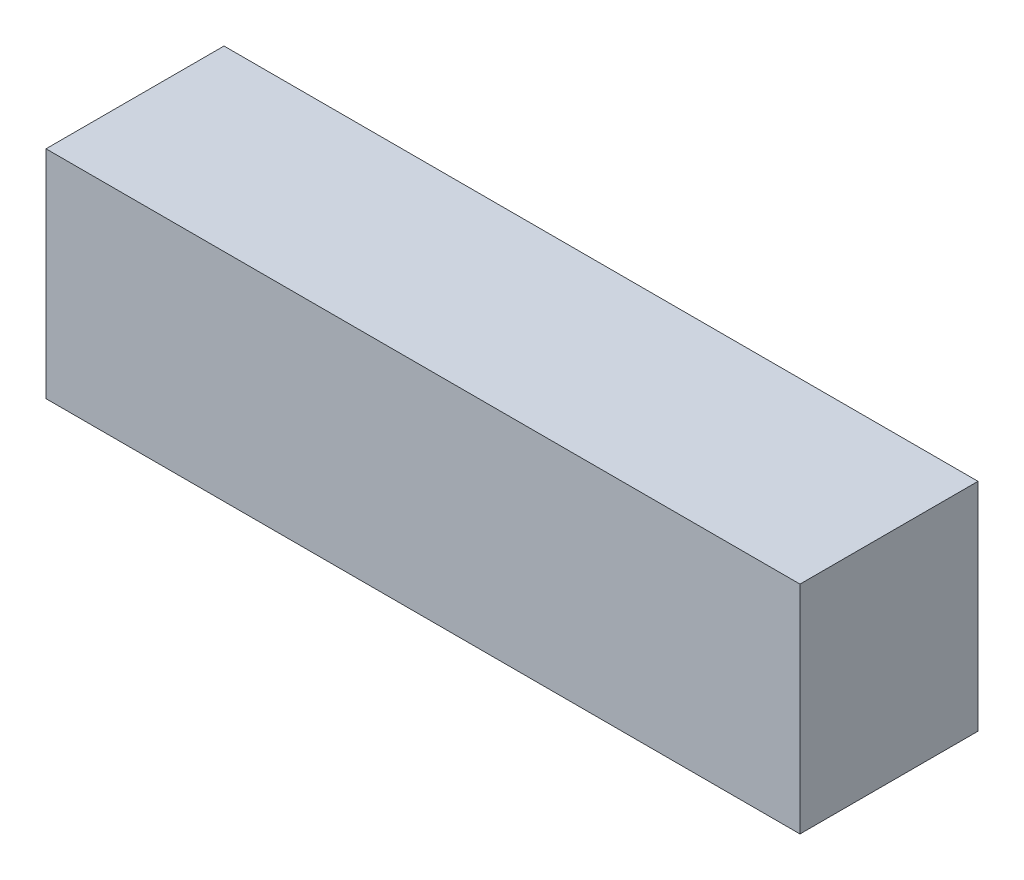
ISO-10303-21;
HEADER;
FILE_DESCRIPTION(('STEP AP214'),'2;1');
FILE_NAME('part.step','',(''),(''),'','','');
FILE_SCHEMA(('AUTOMOTIVE_DESIGN { 1 0 10303 214 1 1 1 1 }'));
ENDSEC;
DATA;
#1=APPLICATION_CONTEXT('core data for automotive mechanical design processes');
#2=APPLICATION_PROTOCOL_DEFINITION('international standard','automotive_design',2000,#1);
#3=PRODUCT_CONTEXT('',#1,'mechanical');
#4=PRODUCT('Part','Part','',(#3));
#5=PRODUCT_RELATED_PRODUCT_CATEGORY('part','',(#4));
#6=PRODUCT_DEFINITION_FORMATION('','',#4);
#7=PRODUCT_DEFINITION_CONTEXT('part definition',#1,'design');
#8=PRODUCT_DEFINITION('design','',#6,#7);
#9=PRODUCT_DEFINITION_SHAPE('','',#8);
#10=(LENGTH_UNIT() NAMED_UNIT(*) SI_UNIT(.MILLI.,.METRE.));
#11=(NAMED_UNIT(*) PLANE_ANGLE_UNIT() SI_UNIT($,.RADIAN.));
#12=(NAMED_UNIT(*) SI_UNIT($,.STERADIAN.) SOLID_ANGLE_UNIT());
#13=UNCERTAINTY_MEASURE_WITH_UNIT(LENGTH_MEASURE(1.E-05),#10,'distance_accuracy_value','');
#14=(GEOMETRIC_REPRESENTATION_CONTEXT(3) GLOBAL_UNCERTAINTY_ASSIGNED_CONTEXT((#13)) GLOBAL_UNIT_ASSIGNED_CONTEXT((#10,
#11,#12)) REPRESENTATION_CONTEXT('',''));
#15=CARTESIAN_POINT('',(0.,0.,0.));
#16=DIRECTION('',(0.,0.,1.));
#17=DIRECTION('',(1.,0.,0.));
#18=AXIS2_PLACEMENT_3D('',#15,#16,#17);
#19=CARTESIAN_POINT('',(0.,31.,0.));
#20=DIRECTION('',(1.,0.,0.));
#21=DIRECTION('',(0.,0.,-1.));
#22=AXIS2_PLACEMENT_3D('',#19,#20,#21);
#23=PLANE('',#22);
#24=DIRECTION('',(0.,0.,1.));
#25=VECTOR('',#24,1.);
#26=CARTESIAN_POINT('',(0.,0.,0.));
#27=LINE('',#26,#25);
#28=CARTESIAN_POINT('',(0.,0.,-25.5));
#29=VERTEX_POINT('',#28);
#30=CARTESIAN_POINT('',(0.,0.,0.));
#31=VERTEX_POINT('',#30);
#32=EDGE_CURVE('E100',#29,#31,#27,.T.);
#33=ORIENTED_EDGE('',*,*,#32,.T.);
#34=DIRECTION('',(0.,-1.,0.));
#35=VECTOR('',#34,1.);
#36=CARTESIAN_POINT('',(0.,31.,0.));
#37=LINE('',#36,#35);
#38=CARTESIAN_POINT('',(0.,31.,0.));
#39=VERTEX_POINT('',#38);
#40=EDGE_CURVE('E11',#39,#31,#37,.T.);
#41=ORIENTED_EDGE('',*,*,#40,.F.);
#42=DIRECTION('',(0.,0.,1.));
#43=VECTOR('',#42,1.);
#44=CARTESIAN_POINT('',(0.,31.,0.));
#45=LINE('',#44,#43);
#46=CARTESIAN_POINT('',(0.,31.,-25.5));
#47=VERTEX_POINT('',#46);
#48=EDGE_CURVE('E88',#47,#39,#45,.T.);
#49=ORIENTED_EDGE('',*,*,#48,.F.);
#50=DIRECTION('',(0.,-1.,0.));
#51=VECTOR('',#50,1.);
#52=CARTESIAN_POINT('',(0.,31.,-25.5));
#53=LINE('',#52,#51);
#54=EDGE_CURVE('E96',#47,#29,#53,.T.);
#55=ORIENTED_EDGE('',*,*,#54,.T.);
#56=EDGE_LOOP('',(#33,#41,#49,#55));
#57=FACE_BOUND('',#56,.T.);
#58=ADVANCED_FACE('F37',(#57),#23,.F.);
#59=CARTESIAN_POINT('',(0.,31.,0.));
#60=DIRECTION('',(0.,0.,-1.));
#61=DIRECTION('',(-1.,0.,0.));
#62=AXIS2_PLACEMENT_3D('',#59,#60,#61);
#63=PLANE('',#62);
#64=DIRECTION('',(1.,0.,0.));
#65=VECTOR('',#64,1.);
#66=CARTESIAN_POINT('',(0.,0.,0.));
#67=LINE('',#66,#65);
#68=CARTESIAN_POINT('',(108.,0.,0.));
#69=VERTEX_POINT('',#68);
#70=EDGE_CURVE('E92',#31,#69,#67,.T.);
#71=ORIENTED_EDGE('',*,*,#70,.T.);
#72=DIRECTION('',(0.,-1.,0.));
#73=VECTOR('',#72,1.);
#74=CARTESIAN_POINT('',(108.,31.,0.));
#75=LINE('',#74,#73);
#76=CARTESIAN_POINT('',(108.,31.,0.));
#77=VERTEX_POINT('',#76);
#78=EDGE_CURVE('E45',#77,#69,#75,.T.);
#79=ORIENTED_EDGE('',*,*,#78,.F.);
#80=DIRECTION('',(1.,0.,0.));
#81=VECTOR('',#80,1.);
#82=CARTESIAN_POINT('',(0.,31.,0.));
#83=LINE('',#82,#81);
#84=EDGE_CURVE('E83',#39,#77,#83,.T.);
#85=ORIENTED_EDGE('',*,*,#84,.F.);
#86=ORIENTED_EDGE('',*,*,#40,.T.);
#87=EDGE_LOOP('',(#71,#79,#85,#86));
#88=FACE_BOUND('',#87,.T.);
#89=ADVANCED_FACE('F91',(#88),#63,.F.);
#90=CARTESIAN_POINT('',(108.,31.,0.));
#91=DIRECTION('',(-1.,0.,0.));
#92=DIRECTION('',(0.,0.,1.));
#93=AXIS2_PLACEMENT_3D('',#90,#91,#92);
#94=PLANE('',#93);
#95=DIRECTION('',(0.,0.,-1.));
#96=VECTOR('',#95,1.);
#97=CARTESIAN_POINT('',(108.,0.,0.));
#98=LINE('',#97,#96);
#99=CARTESIAN_POINT('',(108.,0.,-25.5));
#100=VERTEX_POINT('',#99);
#101=EDGE_CURVE('E70',#69,#100,#98,.T.);
#102=ORIENTED_EDGE('',*,*,#101,.T.);
#103=DIRECTION('',(0.,-1.,0.));
#104=VECTOR('',#103,1.);
#105=CARTESIAN_POINT('',(108.,31.,-25.5));
#106=LINE('',#105,#104);
#107=CARTESIAN_POINT('',(108.,31.,-25.5));
#108=VERTEX_POINT('',#107);
#109=EDGE_CURVE('E93',#108,#100,#106,.T.);
#110=ORIENTED_EDGE('',*,*,#109,.F.);
#111=DIRECTION('',(0.,0.,-1.));
#112=VECTOR('',#111,1.);
#113=CARTESIAN_POINT('',(108.,31.,0.));
#114=LINE('',#113,#112);
#115=EDGE_CURVE('E86',#77,#108,#114,.T.);
#116=ORIENTED_EDGE('',*,*,#115,.F.);
#117=ORIENTED_EDGE('',*,*,#78,.T.);
#118=EDGE_LOOP('',(#102,#110,#116,#117));
#119=FACE_BOUND('',#118,.T.);
#120=ADVANCED_FACE('F94',(#119),#94,.F.);
#121=CARTESIAN_POINT('',(0.,31.,-25.5));
#122=DIRECTION('',(0.,0.,1.));
#123=DIRECTION('',(1.,0.,0.));
#124=AXIS2_PLACEMENT_3D('',#121,#122,#123);
#125=PLANE('',#124);
#126=DIRECTION('',(-1.,0.,0.));
#127=VECTOR('',#126,1.);
#128=CARTESIAN_POINT('',(0.,0.,-25.5));
#129=LINE('',#128,#127);
#130=EDGE_CURVE('E76',#100,#29,#129,.T.);
#131=ORIENTED_EDGE('',*,*,#130,.T.);
#132=ORIENTED_EDGE('',*,*,#54,.F.);
#133=DIRECTION('',(-1.,0.,0.));
#134=VECTOR('',#133,1.);
#135=CARTESIAN_POINT('',(0.,31.,-25.5));
#136=LINE('',#135,#134);
#137=EDGE_CURVE('E53',#108,#47,#136,.T.);
#138=ORIENTED_EDGE('',*,*,#137,.F.);
#139=ORIENTED_EDGE('',*,*,#109,.T.);
#140=EDGE_LOOP('',(#131,#132,#138,#139));
#141=FACE_BOUND('',#140,.T.);
#142=ADVANCED_FACE('F107',(#141),#125,.F.);
#143=CARTESIAN_POINT('',(0.,31.,0.));
#144=DIRECTION('',(0.,-1.,0.));
#145=DIRECTION('',(0.,0.,-1.));
#146=AXIS2_PLACEMENT_3D('',#143,#144,#145);
#147=PLANE('',#146);
#148=ORIENTED_EDGE('',*,*,#48,.T.);
#149=ORIENTED_EDGE('',*,*,#84,.T.);
#150=ORIENTED_EDGE('',*,*,#115,.T.);
#151=ORIENTED_EDGE('',*,*,#137,.T.);
#152=EDGE_LOOP('',(#148,#149,#150,#151));
#153=FACE_BOUND('',#152,.T.);
#154=ADVANCED_FACE('F84',(#153),#147,.F.);
#155=CARTESIAN_POINT('',(0.,0.,0.));
#156=DIRECTION('',(0.,-1.,0.));
#157=DIRECTION('',(0.,0.,-1.));
#158=AXIS2_PLACEMENT_3D('',#155,#156,#157);
#159=PLANE('',#158);
#160=ORIENTED_EDGE('',*,*,#32,.F.);
#161=ORIENTED_EDGE('',*,*,#130,.F.);
#162=ORIENTED_EDGE('',*,*,#101,.F.);
#163=ORIENTED_EDGE('',*,*,#70,.F.);
#164=EDGE_LOOP('',(#160,#161,#162,#163));
#165=FACE_BOUND('',#164,.T.);
#166=ADVANCED_FACE('F110',(#165),#159,.T.);
#167=CLOSED_SHELL('',(#58,#89,#120,#142,#154,#166));
#168=MANIFOLD_SOLID_BREP('B2',#167);
#169=ADVANCED_BREP_SHAPE_REPRESENTATION('',(#18,#168),#14);
#170=SHAPE_DEFINITION_REPRESENTATION(#9,#169);
ENDSEC;
END-ISO-10303-21;
